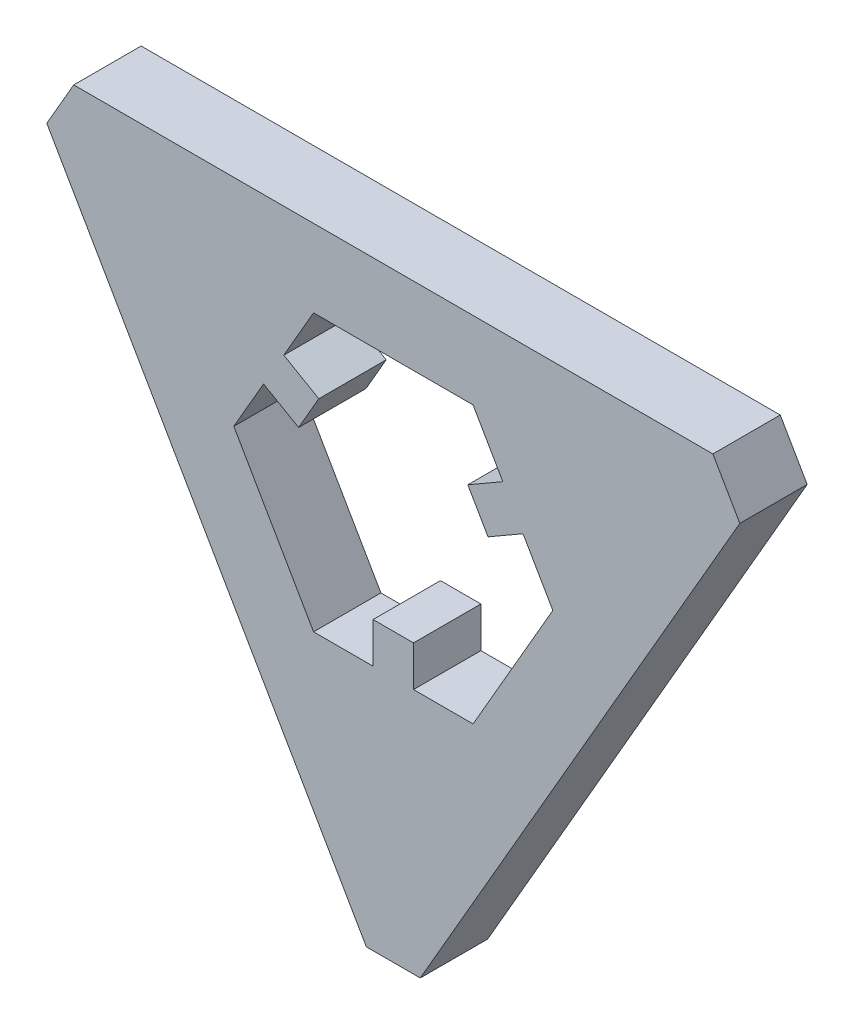
ISO-10303-21;
HEADER;
FILE_DESCRIPTION(('STEP AP214'),'2;1');
FILE_NAME('part.step','',(''),(''),'','','');
FILE_SCHEMA(('AUTOMOTIVE_DESIGN { 1 0 10303 214 1 1 1 1 }'));
ENDSEC;
DATA;
#1=APPLICATION_CONTEXT('core data for automotive mechanical design processes');
#2=APPLICATION_PROTOCOL_DEFINITION('international standard','automotive_design',2000,#1);
#3=PRODUCT_CONTEXT('',#1,'mechanical');
#4=PRODUCT('Part','Part','',(#3));
#5=PRODUCT_RELATED_PRODUCT_CATEGORY('part','',(#4));
#6=PRODUCT_DEFINITION_FORMATION('','',#4);
#7=PRODUCT_DEFINITION_CONTEXT('part definition',#1,'design');
#8=PRODUCT_DEFINITION('design','',#6,#7);
#9=PRODUCT_DEFINITION_SHAPE('','',#8);
#10=(LENGTH_UNIT() NAMED_UNIT(*) SI_UNIT(.MILLI.,.METRE.));
#11=(NAMED_UNIT(*) PLANE_ANGLE_UNIT() SI_UNIT($,.RADIAN.));
#12=(NAMED_UNIT(*) SI_UNIT($,.STERADIAN.) SOLID_ANGLE_UNIT());
#13=UNCERTAINTY_MEASURE_WITH_UNIT(LENGTH_MEASURE(1.E-05),#10,'distance_accuracy_value','');
#14=(GEOMETRIC_REPRESENTATION_CONTEXT(3) GLOBAL_UNCERTAINTY_ASSIGNED_CONTEXT((#13)) GLOBAL_UNIT_ASSIGNED_CONTEXT((#10,
#11,#12)) REPRESENTATION_CONTEXT('',''));
#15=CARTESIAN_POINT('',(0.,0.,0.));
#16=DIRECTION('',(0.,0.,1.));
#17=DIRECTION('',(1.,0.,0.));
#18=AXIS2_PLACEMENT_3D('',#15,#16,#17);
#19=CARTESIAN_POINT('',(0.,0.,-250.));
#20=DIRECTION('',(0.,0.,1.));
#21=DIRECTION('',(1.,0.,0.));
#22=AXIS2_PLACEMENT_3D('',#19,#20,#21);
#23=PLANE('',#22);
#24=DIRECTION('',(-0.5,-0.866025403784439,0.));
#25=VECTOR('',#24,1.);
#26=CARTESIAN_POINT('',(-23.6713610367747,0.,-250.));
#27=LINE('',#26,#25);
#28=CARTESIAN_POINT('',(-11.8356805183874,20.5,-250.));
#29=VERTEX_POINT('',#28);
#30=CARTESIAN_POINT('',(-16.2535207775811,12.8480762113533,-250.));
#31=VERTEX_POINT('',#30);
#32=EDGE_CURVE('E127',#29,#31,#27,.T.);
#33=ORIENTED_EDGE('',*,*,#32,.F.);
#34=DIRECTION('',(-1.,0.,0.));
#35=VECTOR('',#34,1.);
#36=CARTESIAN_POINT('',(-11.8356805183874,20.5,-250.));
#37=LINE('',#36,#35);
#38=CARTESIAN_POINT('',(11.8356805183873,20.5,-250.));
#39=VERTEX_POINT('',#38);
#40=EDGE_CURVE('E153',#39,#29,#37,.T.);
#41=ORIENTED_EDGE('',*,*,#40,.F.);
#42=DIRECTION('',(-0.5,0.866025403784439,0.));
#43=VECTOR('',#42,1.);
#44=CARTESIAN_POINT('',(11.8356805183873,20.5,-250.));
#45=LINE('',#44,#43);
#46=CARTESIAN_POINT('',(16.2535207775809,12.8480762113534,-250.));
#47=VERTEX_POINT('',#46);
#48=EDGE_CURVE('E156',#47,#39,#45,.T.);
#49=ORIENTED_EDGE('',*,*,#48,.F.);
#50=DIRECTION('',(0.86602540378443,0.500000000000016,0.));
#51=VECTOR('',#50,1.);
#52=CARTESIAN_POINT('',(16.2535207775809,12.8480762113534,-250.));
#53=LINE('',#52,#51);
#54=CARTESIAN_POINT('',(11.0573683548744,9.84807621135332,-250.));
#55=VERTEX_POINT('',#54);
#56=EDGE_CURVE('E174',#55,#47,#53,.T.);
#57=ORIENTED_EDGE('',*,*,#56,.F.);
#58=DIRECTION('',(-0.500000000000003,0.866025403784437,0.));
#59=VECTOR('',#58,1.);
#60=CARTESIAN_POINT('',(11.0573683548744,9.84807621135332,-250.));
#61=LINE('',#60,#59);
#62=CARTESIAN_POINT('',(14.0573683548744,4.65192378864669,-250.));
#63=VERTEX_POINT('',#62);
#64=EDGE_CURVE('E171',#63,#55,#61,.T.);
#65=ORIENTED_EDGE('',*,*,#64,.F.);
#66=DIRECTION('',(-0.866025403784437,-0.500000000000003,0.));
#67=VECTOR('',#66,1.);
#68=CARTESIAN_POINT('',(14.0573683548744,4.65192378864669,-250.));
#69=LINE('',#68,#67);
#70=CARTESIAN_POINT('',(19.253520777581,7.65192378864671,-250.));
#71=VERTEX_POINT('',#70);
#72=EDGE_CURVE('E168',#71,#63,#69,.T.);
#73=ORIENTED_EDGE('',*,*,#72,.F.);
#74=DIRECTION('',(-0.5,0.866025403784439,0.));
#75=VECTOR('',#74,1.);
#76=CARTESIAN_POINT('',(11.8356805183873,20.5,-250.));
#77=LINE('',#76,#75);
#78=CARTESIAN_POINT('',(23.6713610367747,0.,-250.));
#79=VERTEX_POINT('',#78);
#80=EDGE_CURVE('E130',#79,#71,#77,.T.);
#81=ORIENTED_EDGE('',*,*,#80,.F.);
#82=DIRECTION('',(0.5,0.866025403784439,0.));
#83=VECTOR('',#82,1.);
#84=CARTESIAN_POINT('',(23.6713610367747,0.,-250.));
#85=LINE('',#84,#83);
#86=CARTESIAN_POINT('',(11.8356805183873,-20.5,-250.));
#87=VERTEX_POINT('',#86);
#88=EDGE_CURVE('E141',#87,#79,#85,.T.);
#89=ORIENTED_EDGE('',*,*,#88,.F.);
#90=DIRECTION('',(1.,0.,0.));
#91=VECTOR('',#90,1.);
#92=CARTESIAN_POINT('',(11.8356805183873,-20.5,-250.));
#93=LINE('',#92,#91);
#94=CARTESIAN_POINT('',(3.,-20.5,-250.));
#95=VERTEX_POINT('',#94);
#96=EDGE_CURVE('E144',#95,#87,#93,.T.);
#97=ORIENTED_EDGE('',*,*,#96,.F.);
#98=DIRECTION('',(0.,-1.,0.));
#99=VECTOR('',#98,1.);
#100=CARTESIAN_POINT('',(3.,-20.5,-250.));
#101=LINE('',#100,#99);
#102=CARTESIAN_POINT('',(3.,-14.5,-250.));
#103=VERTEX_POINT('',#102);
#104=EDGE_CURVE('E189',#103,#95,#101,.T.);
#105=ORIENTED_EDGE('',*,*,#104,.F.);
#106=DIRECTION('',(1.,0.,0.));
#107=VECTOR('',#106,1.);
#108=CARTESIAN_POINT('',(3.,-14.5,-250.));
#109=LINE('',#108,#107);
#110=CARTESIAN_POINT('',(-3.,-14.5,-250.));
#111=VERTEX_POINT('',#110);
#112=EDGE_CURVE('E99',#111,#103,#109,.T.);
#113=ORIENTED_EDGE('',*,*,#112,.F.);
#114=DIRECTION('',(0.,1.,0.));
#115=VECTOR('',#114,1.);
#116=CARTESIAN_POINT('',(-3.,-14.5,-250.));
#117=LINE('',#116,#115);
#118=CARTESIAN_POINT('',(-3.,-20.5,-250.));
#119=VERTEX_POINT('',#118);
#120=EDGE_CURVE('E186',#119,#111,#117,.T.);
#121=ORIENTED_EDGE('',*,*,#120,.F.);
#122=DIRECTION('',(1.,0.,0.));
#123=VECTOR('',#122,1.);
#124=CARTESIAN_POINT('',(11.8356805183873,-20.5,-250.));
#125=LINE('',#124,#123);
#126=CARTESIAN_POINT('',(-11.8356805183873,-20.5,-250.));
#127=VERTEX_POINT('',#126);
#128=EDGE_CURVE('E124',#127,#119,#125,.T.);
#129=ORIENTED_EDGE('',*,*,#128,.F.);
#130=DIRECTION('',(0.5,-0.866025403784438,0.));
#131=VECTOR('',#130,1.);
#132=CARTESIAN_POINT('',(-11.8356805183873,-20.5,-250.));
#133=LINE('',#132,#131);
#134=CARTESIAN_POINT('',(-23.6713610367747,0.,-250.));
#135=VERTEX_POINT('',#134);
#136=EDGE_CURVE('E147',#135,#127,#133,.T.);
#137=ORIENTED_EDGE('',*,*,#136,.F.);
#138=DIRECTION('',(-0.5,-0.866025403784439,0.));
#139=VECTOR('',#138,1.);
#140=CARTESIAN_POINT('',(-23.6713610367747,0.,-250.));
#141=LINE('',#140,#139);
#142=CARTESIAN_POINT('',(-19.2535207775811,7.65192378864667,-250.));
#143=VERTEX_POINT('',#142);
#144=EDGE_CURVE('E150',#143,#135,#141,.T.);
#145=ORIENTED_EDGE('',*,*,#144,.F.);
#146=DIRECTION('',(-0.866025403784439,0.499999999999999,0.));
#147=VECTOR('',#146,1.);
#148=CARTESIAN_POINT('',(-19.2535207775811,7.65192378864667,-250.));
#149=LINE('',#148,#147);
#150=CARTESIAN_POINT('',(-14.0573683548744,4.65192378864668,-250.));
#151=VERTEX_POINT('',#150);
#152=EDGE_CURVE('E183',#151,#143,#149,.T.);
#153=ORIENTED_EDGE('',*,*,#152,.F.);
#154=DIRECTION('',(-0.499999999999999,-0.866025403784439,0.));
#155=VECTOR('',#154,1.);
#156=CARTESIAN_POINT('',(-14.0573683548744,4.65192378864668,-250.));
#157=LINE('',#156,#155);
#158=CARTESIAN_POINT('',(-11.0573683548744,9.84807621135332,-250.));
#159=VERTEX_POINT('',#158);
#160=EDGE_CURVE('E180',#159,#151,#157,.T.);
#161=ORIENTED_EDGE('',*,*,#160,.F.);
#162=DIRECTION('',(0.866025403784442,-0.499999999999995,0.));
#163=VECTOR('',#162,1.);
#164=CARTESIAN_POINT('',(-11.0573683548744,9.84807621135332,-250.));
#165=LINE('',#164,#163);
#166=EDGE_CURVE('E177',#31,#159,#165,.T.);
#167=ORIENTED_EDGE('',*,*,#166,.F.);
#168=EDGE_LOOP('',(#33,#41,#49,#57,#65,#73,#81,#89,#97,#105,#113,#121,#129,#137,#145,#153,#161,#167));
#169=FACE_BOUND('',#168,.T.);
#170=DIRECTION('',(-0.500000000000001,-0.866025403784438,0.));
#171=VECTOR('',#170,1.);
#172=CARTESIAN_POINT('',(4.00002711889661,-57.0720970525392,-250.));
#173=LINE('',#172,#171);
#174=CARTESIAN_POINT('',(51.4258100782776,25.0717686218424,-250.));
#175=VERTEX_POINT('',#174);
#176=CARTESIAN_POINT('',(4.00002711889663,-57.0720970525392,-250.));
#177=VERTEX_POINT('',#176);
#178=EDGE_CURVE('E135',#175,#177,#173,.T.);
#179=ORIENTED_EDGE('',*,*,#178,.F.);
#180=DIRECTION('',(0.499999910244853,-0.866025455604591,0.));
#181=VECTOR('',#180,1.);
#182=CARTESIAN_POINT('',(47.4258047104851,31.9999828076548,-250.));
#183=LINE('',#182,#181);
#184=CARTESIAN_POINT('',(47.4258047104851,31.9999828076548,-250.));
#185=VERTEX_POINT('',#184);
#186=EDGE_CURVE('E159',#185,#175,#183,.T.);
#187=ORIENTED_EDGE('',*,*,#186,.F.);
#188=DIRECTION('',(1.,0.,0.));
#189=VECTOR('',#188,1.);
#190=CARTESIAN_POINT('',(47.4258047104851,31.9999828076548,-250.));
#191=LINE('',#190,#189);
#192=CARTESIAN_POINT('',(-47.4255638428803,31.9999828076547,-250.));
#193=VERTEX_POINT('',#192);
#194=EDGE_CURVE('E132',#193,#185,#191,.T.);
#195=ORIENTED_EDGE('',*,*,#194,.F.);
#196=DIRECTION('',(0.500034807579477,0.866005306686371,0.));
#197=VECTOR('',#196,1.);
#198=CARTESIAN_POINT('',(-51.4258483825629,25.0719298259231,-250.));
#199=LINE('',#198,#197);
#200=CARTESIAN_POINT('',(-51.4258483825629,25.0719298259231,-250.));
#201=VERTEX_POINT('',#200);
#202=EDGE_CURVE('E165',#201,#193,#199,.T.);
#203=ORIENTED_EDGE('',*,*,#202,.F.);
#204=DIRECTION('',(-0.5,0.866025403784438,0.));
#205=VECTOR('',#204,1.);
#206=CARTESIAN_POINT('',(-51.4258483825629,25.0719298259231,-250.));
#207=LINE('',#206,#205);
#208=CARTESIAN_POINT('',(-3.99997235196278,-57.0720970525392,-250.));
#209=VERTEX_POINT('',#208);
#210=EDGE_CURVE('E138',#209,#201,#207,.T.);
#211=ORIENTED_EDGE('',*,*,#210,.F.);
#212=DIRECTION('',(-1.,0.,0.));
#213=VECTOR('',#212,1.);
#214=CARTESIAN_POINT('',(4.00002711889663,-57.0720970525392,-250.));
#215=LINE('',#214,#213);
#216=EDGE_CURVE('E162',#177,#209,#215,.T.);
#217=ORIENTED_EDGE('',*,*,#216,.F.);
#218=EDGE_LOOP('',(#179,#187,#195,#203,#211,#217));
#219=FACE_BOUND('',#218,.T.);
#220=ADVANCED_FACE('F45',(#169,#219),#23,.T.);
#221=CARTESIAN_POINT('',(23.6713610367747,0.,-140.));
#222=DIRECTION('',(-0.866025403784439,0.5,0.));
#223=DIRECTION('',(0.,0.,1.));
#224=AXIS2_PLACEMENT_3D('',#221,#222,#223);
#225=PLANE('',#224);
#226=DIRECTION('',(0.,0.,1.));
#227=VECTOR('',#226,1.);
#228=CARTESIAN_POINT('',(11.8356805183873,-20.5,-140.));
#229=LINE('',#228,#227);
#230=CARTESIAN_POINT('',(11.8356805183873,-20.5,-260.));
#231=VERTEX_POINT('',#230);
#232=EDGE_CURVE('E48',#231,#87,#229,.T.);
#233=ORIENTED_EDGE('',*,*,#232,.T.);
#234=ORIENTED_EDGE('',*,*,#88,.T.);
#235=DIRECTION('',(0.,0.,-1.));
#236=VECTOR('',#235,1.);
#237=CARTESIAN_POINT('',(23.6713610367747,0.,-140.));
#238=LINE('',#237,#236);
#239=CARTESIAN_POINT('',(23.6713610367747,0.,-260.));
#240=VERTEX_POINT('',#239);
#241=EDGE_CURVE('E241',#79,#240,#238,.T.);
#242=ORIENTED_EDGE('',*,*,#241,.T.);
#243=DIRECTION('',(0.5,0.866025403784439,0.));
#244=VECTOR('',#243,1.);
#245=CARTESIAN_POINT('',(11.8356805183873,-20.5,-260.));
#246=LINE('',#245,#244);
#247=EDGE_CURVE('E280',#231,#240,#246,.T.);
#248=ORIENTED_EDGE('',*,*,#247,.F.);
#249=EDGE_LOOP('',(#233,#234,#242,#248));
#250=FACE_BOUND('',#249,.T.);
#251=ADVANCED_FACE('F274',(#250),#225,.T.);
#252=CARTESIAN_POINT('',(-11.8356805183873,-20.5,-140.));
#253=DIRECTION('',(0.866025403784438,0.5,0.));
#254=DIRECTION('',(0.,0.,-1.));
#255=AXIS2_PLACEMENT_3D('',#252,#253,#254);
#256=PLANE('',#255);
#257=DIRECTION('',(0.,0.,-1.));
#258=VECTOR('',#257,1.);
#259=CARTESIAN_POINT('',(-23.6713610367747,0.,-140.));
#260=LINE('',#259,#258);
#261=CARTESIAN_POINT('',(-23.6713610367747,0.,-260.));
#262=VERTEX_POINT('',#261);
#263=EDGE_CURVE('E254',#135,#262,#260,.T.);
#264=ORIENTED_EDGE('',*,*,#263,.F.);
#265=ORIENTED_EDGE('',*,*,#136,.T.);
#266=DIRECTION('',(0.,0.,-1.));
#267=VECTOR('',#266,1.);
#268=CARTESIAN_POINT('',(-11.8356805183873,-20.5,-140.));
#269=LINE('',#268,#267);
#270=CARTESIAN_POINT('',(-11.8356805183873,-20.5,-260.));
#271=VERTEX_POINT('',#270);
#272=EDGE_CURVE('E257',#127,#271,#269,.T.);
#273=ORIENTED_EDGE('',*,*,#272,.T.);
#274=DIRECTION('',(0.5,-0.866025403784438,0.));
#275=VECTOR('',#274,1.);
#276=CARTESIAN_POINT('',(-23.6713610367747,0.,-260.));
#277=LINE('',#276,#275);
#278=EDGE_CURVE('E439',#262,#271,#277,.T.);
#279=ORIENTED_EDGE('',*,*,#278,.F.);
#280=EDGE_LOOP('',(#264,#265,#273,#279));
#281=FACE_BOUND('',#280,.T.);
#282=ADVANCED_FACE('F606',(#281),#256,.T.);
#283=CARTESIAN_POINT('',(-11.8356805183874,20.5,-140.));
#284=DIRECTION('',(0.,-1.,0.));
#285=DIRECTION('',(0.,0.,-1.));
#286=AXIS2_PLACEMENT_3D('',#283,#284,#285);
#287=PLANE('',#286);
#288=DIRECTION('',(0.,0.,-1.));
#289=VECTOR('',#288,1.);
#290=CARTESIAN_POINT('',(11.8356805183873,20.5,-140.));
#291=LINE('',#290,#289);
#292=CARTESIAN_POINT('',(11.8356805183873,20.5,-260.));
#293=VERTEX_POINT('',#292);
#294=EDGE_CURVE('E246',#39,#293,#291,.T.);
#295=ORIENTED_EDGE('',*,*,#294,.F.);
#296=ORIENTED_EDGE('',*,*,#40,.T.);
#297=DIRECTION('',(0.,0.,-1.));
#298=VECTOR('',#297,1.);
#299=CARTESIAN_POINT('',(-11.8356805183874,20.5,-140.));
#300=LINE('',#299,#298);
#301=CARTESIAN_POINT('',(-11.8356805183874,20.5,-260.));
#302=VERTEX_POINT('',#301);
#303=EDGE_CURVE('E250',#29,#302,#300,.T.);
#304=ORIENTED_EDGE('',*,*,#303,.T.);
#305=DIRECTION('',(-1.,0.,0.));
#306=VECTOR('',#305,1.);
#307=CARTESIAN_POINT('',(11.8356805183873,20.5,-260.));
#308=LINE('',#307,#306);
#309=EDGE_CURVE('E418',#293,#302,#308,.T.);
#310=ORIENTED_EDGE('',*,*,#309,.F.);
#311=EDGE_LOOP('',(#295,#296,#304,#310));
#312=FACE_BOUND('',#311,.T.);
#313=ADVANCED_FACE('F422',(#312),#287,.T.);
#314=CARTESIAN_POINT('',(11.8356805183873,20.5,-140.));
#315=DIRECTION('',(-0.866025403784439,-0.5,0.));
#316=DIRECTION('',(-0.5,0.866025403784439,0.));
#317=AXIS2_PLACEMENT_3D('',#314,#315,#316);
#318=PLANE('',#317);
#319=ORIENTED_EDGE('',*,*,#241,.F.);
#320=ORIENTED_EDGE('',*,*,#80,.T.);
#321=DIRECTION('',(0.,0.,-1.));
#322=VECTOR('',#321,1.);
#323=CARTESIAN_POINT('',(19.253520777581,7.65192378864671,151.591109915469));
#324=LINE('',#323,#322);
#325=CARTESIAN_POINT('',(19.253520777581,7.65192378864671,-260.));
#326=VERTEX_POINT('',#325);
#327=EDGE_CURVE('E11',#71,#326,#324,.T.);
#328=ORIENTED_EDGE('',*,*,#327,.T.);
#329=DIRECTION('',(-0.5,0.866025403784439,0.));
#330=VECTOR('',#329,1.);
#331=CARTESIAN_POINT('',(23.6713610367747,0.,-260.));
#332=LINE('',#331,#330);
#333=EDGE_CURVE('E421',#240,#326,#332,.T.);
#334=ORIENTED_EDGE('',*,*,#333,.F.);
#335=EDGE_LOOP('',(#319,#320,#328,#334));
#336=FACE_BOUND('',#335,.T.);
#337=ADVANCED_FACE('F554',(#336),#318,.T.);
#338=CARTESIAN_POINT('',(14.0573683548744,4.65192378864669,151.591109915469));
#339=DIRECTION('',(0.500000000000003,-0.866025403784437,0.));
#340=DIRECTION('',(0.866025403784437,0.500000000000003,0.));
#341=AXIS2_PLACEMENT_3D('',#338,#339,#340);
#342=PLANE('',#341);
#343=ORIENTED_EDGE('',*,*,#327,.F.);
#344=ORIENTED_EDGE('',*,*,#72,.T.);
#345=DIRECTION('',(0.,0.,-1.));
#346=VECTOR('',#345,1.);
#347=CARTESIAN_POINT('',(14.0573683548744,4.65192378864669,151.591109915469));
#348=LINE('',#347,#346);
#349=CARTESIAN_POINT('',(14.0573683548744,4.65192378864669,-260.));
#350=VERTEX_POINT('',#349);
#351=EDGE_CURVE('E195',#63,#350,#348,.T.);
#352=ORIENTED_EDGE('',*,*,#351,.T.);
#353=DIRECTION('',(-0.866025403784437,-0.500000000000003,0.));
#354=VECTOR('',#353,1.);
#355=CARTESIAN_POINT('',(14.0573683548744,4.65192378864669,-260.));
#356=LINE('',#355,#354);
#357=EDGE_CURVE('E201',#326,#350,#356,.T.);
#358=ORIENTED_EDGE('',*,*,#357,.F.);
#359=EDGE_LOOP('',(#343,#344,#352,#358));
#360=FACE_BOUND('',#359,.T.);
#361=ADVANCED_FACE('F591',(#360),#342,.T.);
#362=CARTESIAN_POINT('',(-23.6713610367747,0.,-140.));
#363=DIRECTION('',(0.866025403784439,-0.5,0.));
#364=DIRECTION('',(0.,0.,-1.));
#365=AXIS2_PLACEMENT_3D('',#362,#363,#364);
#366=PLANE('',#365);
#367=ORIENTED_EDGE('',*,*,#303,.F.);
#368=ORIENTED_EDGE('',*,*,#32,.T.);
#369=DIRECTION('',(0.,0.,-1.));
#370=VECTOR('',#369,1.);
#371=CARTESIAN_POINT('',(-16.2535207775811,12.8480762113533,151.591109915469));
#372=LINE('',#371,#370);
#373=CARTESIAN_POINT('',(-16.2535207775811,12.8480762113533,-260.));
#374=VERTEX_POINT('',#373);
#375=EDGE_CURVE('E199',#31,#374,#372,.T.);
#376=ORIENTED_EDGE('',*,*,#375,.T.);
#377=DIRECTION('',(-0.5,-0.866025403784439,0.));
#378=VECTOR('',#377,1.);
#379=CARTESIAN_POINT('',(-11.8356805183874,20.5,-260.));
#380=LINE('',#379,#378);
#381=EDGE_CURVE('E245',#302,#374,#380,.T.);
#382=ORIENTED_EDGE('',*,*,#381,.F.);
#383=EDGE_LOOP('',(#367,#368,#376,#382));
#384=FACE_BOUND('',#383,.T.);
#385=ADVANCED_FACE('F487',(#384),#366,.T.);
#386=CARTESIAN_POINT('',(-11.0573683548744,9.84807621135332,151.591109915469));
#387=DIRECTION('',(0.499999999999995,0.866025403784442,0.));
#388=DIRECTION('',(-0.866025403784442,0.499999999999995,0.));
#389=AXIS2_PLACEMENT_3D('',#386,#387,#388);
#390=PLANE('',#389);
#391=ORIENTED_EDGE('',*,*,#375,.F.);
#392=ORIENTED_EDGE('',*,*,#166,.T.);
#393=DIRECTION('',(0.,0.,-1.));
#394=VECTOR('',#393,1.);
#395=CARTESIAN_POINT('',(-11.0573683548744,9.84807621135332,151.591109915469));
#396=LINE('',#395,#394);
#397=CARTESIAN_POINT('',(-11.0573683548744,9.84807621135332,-260.));
#398=VERTEX_POINT('',#397);
#399=EDGE_CURVE('E207',#159,#398,#396,.T.);
#400=ORIENTED_EDGE('',*,*,#399,.T.);
#401=DIRECTION('',(0.866025403784442,-0.499999999999995,0.));
#402=VECTOR('',#401,1.);
#403=CARTESIAN_POINT('',(-11.0573683548744,9.84807621135332,-260.));
#404=LINE('',#403,#402);
#405=EDGE_CURVE('E358',#374,#398,#404,.T.);
#406=ORIENTED_EDGE('',*,*,#405,.F.);
#407=EDGE_LOOP('',(#391,#392,#400,#406));
#408=FACE_BOUND('',#407,.T.);
#409=ADVANCED_FACE('F368',(#408),#390,.T.);
#410=CARTESIAN_POINT('',(11.8356805183873,-20.5,-140.));
#411=DIRECTION('',(0.,1.,0.));
#412=DIRECTION('',(1.,0.,0.));
#413=AXIS2_PLACEMENT_3D('',#410,#411,#412);
#414=PLANE('',#413);
#415=ORIENTED_EDGE('',*,*,#272,.F.);
#416=ORIENTED_EDGE('',*,*,#128,.T.);
#417=DIRECTION('',(0.,0.,-1.));
#418=VECTOR('',#417,1.);
#419=CARTESIAN_POINT('',(-3.,-20.5,151.591109915469));
#420=LINE('',#419,#418);
#421=CARTESIAN_POINT('',(-3.,-20.5,-260.));
#422=VERTEX_POINT('',#421);
#423=EDGE_CURVE('E211',#119,#422,#420,.T.);
#424=ORIENTED_EDGE('',*,*,#423,.T.);
#425=DIRECTION('',(1.,0.,0.));
#426=VECTOR('',#425,1.);
#427=CARTESIAN_POINT('',(-11.8356805183873,-20.5,-260.));
#428=LINE('',#427,#426);
#429=EDGE_CURVE('E436',#271,#422,#428,.T.);
#430=ORIENTED_EDGE('',*,*,#429,.F.);
#431=EDGE_LOOP('',(#415,#416,#424,#430));
#432=FACE_BOUND('',#431,.T.);
#433=ADVANCED_FACE('F569',(#432),#414,.T.);
#434=CARTESIAN_POINT('',(-3.,-14.5,151.591109915469));
#435=DIRECTION('',(-1.,0.,0.));
#436=DIRECTION('',(0.,-1.,0.));
#437=AXIS2_PLACEMENT_3D('',#434,#435,#436);
#438=PLANE('',#437);
#439=ORIENTED_EDGE('',*,*,#423,.F.);
#440=ORIENTED_EDGE('',*,*,#120,.T.);
#441=DIRECTION('',(0.,0.,-1.));
#442=VECTOR('',#441,1.);
#443=CARTESIAN_POINT('',(-3.,-14.5,151.591109915469));
#444=LINE('',#443,#442);
#445=CARTESIAN_POINT('',(-3.,-14.5,-260.));
#446=VERTEX_POINT('',#445);
#447=EDGE_CURVE('E86',#111,#446,#444,.T.);
#448=ORIENTED_EDGE('',*,*,#447,.T.);
#449=DIRECTION('',(0.,1.,0.));
#450=VECTOR('',#449,1.);
#451=CARTESIAN_POINT('',(-3.,-14.5,-260.));
#452=LINE('',#451,#450);
#453=EDGE_CURVE('E115',#422,#446,#452,.T.);
#454=ORIENTED_EDGE('',*,*,#453,.F.);
#455=EDGE_LOOP('',(#439,#440,#448,#454));
#456=FACE_BOUND('',#455,.T.);
#457=ADVANCED_FACE('F575',(#456),#438,.T.);
#458=CARTESIAN_POINT('',(-1.91521426717856E-05,-12.5360571224422,-260.));
#459=DIRECTION('',(0.,0.,-1.));
#460=DIRECTION('',(0.,-1.,0.));
#461=AXIS2_PLACEMENT_3D('',#458,#459,#460);
#462=PLANE('',#461);
#463=ORIENTED_EDGE('',*,*,#278,.T.);
#464=ORIENTED_EDGE('',*,*,#429,.T.);
#465=ORIENTED_EDGE('',*,*,#453,.T.);
#466=DIRECTION('',(1.,0.,0.));
#467=VECTOR('',#466,1.);
#468=CARTESIAN_POINT('',(3.,-14.5,-260.));
#469=LINE('',#468,#467);
#470=CARTESIAN_POINT('',(3.,-14.5,-260.));
#471=VERTEX_POINT('',#470);
#472=EDGE_CURVE('E95',#446,#471,#469,.T.);
#473=ORIENTED_EDGE('',*,*,#472,.T.);
#474=DIRECTION('',(0.,-1.,0.));
#475=VECTOR('',#474,1.);
#476=CARTESIAN_POINT('',(3.,-20.5,-260.));
#477=LINE('',#476,#475);
#478=CARTESIAN_POINT('',(3.,-20.5,-260.));
#479=VERTEX_POINT('',#478);
#480=EDGE_CURVE('E112',#471,#479,#477,.T.);
#481=ORIENTED_EDGE('',*,*,#480,.T.);
#482=EDGE_CURVE('E285',#479,#231,#428,.T.);
#483=ORIENTED_EDGE('',*,*,#482,.T.);
#484=ORIENTED_EDGE('',*,*,#247,.T.);
#485=ORIENTED_EDGE('',*,*,#333,.T.);
#486=ORIENTED_EDGE('',*,*,#357,.T.);
#487=DIRECTION('',(-0.500000000000003,0.866025403784437,0.));
#488=VECTOR('',#487,1.);
#489=CARTESIAN_POINT('',(11.0573683548744,9.84807621135332,-260.));
#490=LINE('',#489,#488);
#491=CARTESIAN_POINT('',(11.0573683548744,9.84807621135332,-260.));
#492=VERTEX_POINT('',#491);
#493=EDGE_CURVE('E348',#350,#492,#490,.T.);
#494=ORIENTED_EDGE('',*,*,#493,.T.);
#495=DIRECTION('',(0.86602540378443,0.500000000000016,0.));
#496=VECTOR('',#495,1.);
#497=CARTESIAN_POINT('',(16.2535207775809,12.8480762113534,-260.));
#498=LINE('',#497,#496);
#499=CARTESIAN_POINT('',(16.253520777581,12.8480762113534,-260.));
#500=VERTEX_POINT('',#499);
#501=EDGE_CURVE('E198',#492,#500,#498,.T.);
#502=ORIENTED_EDGE('',*,*,#501,.T.);
#503=EDGE_CURVE('E412',#500,#293,#332,.T.);
#504=ORIENTED_EDGE('',*,*,#503,.T.);
#505=ORIENTED_EDGE('',*,*,#309,.T.);
#506=ORIENTED_EDGE('',*,*,#381,.T.);
#507=ORIENTED_EDGE('',*,*,#405,.T.);
#508=DIRECTION('',(-0.499999999999999,-0.866025403784439,0.));
#509=VECTOR('',#508,1.);
#510=CARTESIAN_POINT('',(-14.0573683548744,4.65192378864668,-260.));
#511=LINE('',#510,#509);
#512=CARTESIAN_POINT('',(-14.0573683548744,4.65192378864668,-260.));
#513=VERTEX_POINT('',#512);
#514=EDGE_CURVE('E355',#398,#513,#511,.T.);
#515=ORIENTED_EDGE('',*,*,#514,.T.);
#516=DIRECTION('',(-0.866025403784439,0.499999999999999,0.));
#517=VECTOR('',#516,1.);
#518=CARTESIAN_POINT('',(-19.2535207775811,7.65192378864667,-260.));
#519=LINE('',#518,#517);
#520=CARTESIAN_POINT('',(-19.2535207775811,7.65192378864667,-260.));
#521=VERTEX_POINT('',#520);
#522=EDGE_CURVE('E208',#513,#521,#519,.T.);
#523=ORIENTED_EDGE('',*,*,#522,.T.);
#524=EDGE_CURVE('E425',#521,#262,#380,.T.);
#525=ORIENTED_EDGE('',*,*,#524,.T.);
#526=EDGE_LOOP('',(#463,#464,#465,#473,#481,#483,#484,#485,#486,#494,#502,#504,#505,#506,#507,
#515,#523,#525));
#527=FACE_BOUND('',#526,.T.);
#528=DIRECTION('',(0.499999910244853,-0.866025455604591,0.));
#529=VECTOR('',#528,1.);
#530=CARTESIAN_POINT('',(47.4258047104851,31.9999828076548,-260.));
#531=LINE('',#530,#529);
#532=CARTESIAN_POINT('',(47.4258047104851,31.9999828076548,-260.));
#533=VERTEX_POINT('',#532);
#534=CARTESIAN_POINT('',(51.4258100782776,25.0717686218424,-260.));
#535=VERTEX_POINT('',#534);
#536=EDGE_CURVE('E235',#533,#535,#531,.T.);
#537=ORIENTED_EDGE('',*,*,#536,.T.);
#538=DIRECTION('',(-0.5,-0.866025403784437,0.));
#539=VECTOR('',#538,1.);
#540=CARTESIAN_POINT('',(51.4258100782776,25.0717686218424,-260.));
#541=LINE('',#540,#539);
#542=CARTESIAN_POINT('',(4.00002711889663,-57.0720970525392,-260.));
#543=VERTEX_POINT('',#542);
#544=EDGE_CURVE('E240',#535,#543,#541,.T.);
#545=ORIENTED_EDGE('',*,*,#544,.T.);
#546=DIRECTION('',(-1.,0.,0.));
#547=VECTOR('',#546,1.);
#548=CARTESIAN_POINT('',(-3.99997235196278,-57.0720970525392,-260.));
#549=LINE('',#548,#547);
#550=CARTESIAN_POINT('',(-3.99997235196278,-57.0720970525392,-260.));
#551=VERTEX_POINT('',#550);
#552=EDGE_CURVE('E226',#543,#551,#549,.T.);
#553=ORIENTED_EDGE('',*,*,#552,.T.);
#554=DIRECTION('',(-0.5,0.866025403784439,0.));
#555=VECTOR('',#554,1.);
#556=CARTESIAN_POINT('',(-3.99997235196278,-57.0720970525392,-260.));
#557=LINE('',#556,#555);
#558=CARTESIAN_POINT('',(-51.4258483825629,25.0719298259231,-260.));
#559=VERTEX_POINT('',#558);
#560=EDGE_CURVE('E329',#551,#559,#557,.T.);
#561=ORIENTED_EDGE('',*,*,#560,.T.);
#562=DIRECTION('',(0.500034807579477,0.866005306686371,0.));
#563=VECTOR('',#562,1.);
#564=CARTESIAN_POINT('',(-47.4255638428803,31.9999828076547,-260.));
#565=LINE('',#564,#563);
#566=CARTESIAN_POINT('',(-47.4255638428803,31.9999828076547,-260.));
#567=VERTEX_POINT('',#566);
#568=EDGE_CURVE('E217',#559,#567,#565,.T.);
#569=ORIENTED_EDGE('',*,*,#568,.T.);
#570=DIRECTION('',(1.,0.,0.));
#571=VECTOR('',#570,1.);
#572=CARTESIAN_POINT('',(-47.4255638428803,31.9999828076547,-260.));
#573=LINE('',#572,#571);
#574=EDGE_CURVE('E335',#567,#533,#573,.T.);
#575=ORIENTED_EDGE('',*,*,#574,.T.);
#576=EDGE_LOOP('',(#537,#545,#553,#561,#569,#575));
#577=FACE_BOUND('',#576,.T.);
#578=ADVANCED_FACE('F108',(#527,#577),#462,.T.);
#579=DIRECTION('',(0.,0.,-1.));
#580=VECTOR('',#579,1.);
#581=CARTESIAN_POINT('',(3.,-20.5,151.591109915469));
#582=LINE('',#581,#580);
#583=EDGE_CURVE('E103',#95,#479,#582,.T.);
#584=ORIENTED_EDGE('',*,*,#583,.F.);
#585=ORIENTED_EDGE('',*,*,#96,.T.);
#586=ORIENTED_EDGE('',*,*,#232,.F.);
#587=ORIENTED_EDGE('',*,*,#482,.F.);
#588=EDGE_LOOP('',(#584,#585,#586,#587));
#589=FACE_BOUND('',#588,.T.);
#590=ADVANCED_FACE('F284',(#589),#414,.T.);
#591=CARTESIAN_POINT('',(3.,-14.5,151.591109915469));
#592=DIRECTION('',(0.,1.,0.));
#593=DIRECTION('',(0.,0.,1.));
#594=AXIS2_PLACEMENT_3D('',#591,#592,#593);
#595=PLANE('',#594);
#596=ORIENTED_EDGE('',*,*,#447,.F.);
#597=ORIENTED_EDGE('',*,*,#112,.T.);
#598=DIRECTION('',(0.,0.,-1.));
#599=VECTOR('',#598,1.);
#600=CARTESIAN_POINT('',(3.,-14.5,151.591109915469));
#601=LINE('',#600,#599);
#602=EDGE_CURVE('E92',#103,#471,#601,.T.);
#603=ORIENTED_EDGE('',*,*,#602,.T.);
#604=ORIENTED_EDGE('',*,*,#472,.F.);
#605=EDGE_LOOP('',(#596,#597,#603,#604));
#606=FACE_BOUND('',#605,.T.);
#607=ADVANCED_FACE('F94',(#606),#595,.T.);
#608=CARTESIAN_POINT('',(3.,-20.5,151.591109915469));
#609=DIRECTION('',(1.,0.,0.));
#610=DIRECTION('',(0.,1.,0.));
#611=AXIS2_PLACEMENT_3D('',#608,#609,#610);
#612=PLANE('',#611);
#613=ORIENTED_EDGE('',*,*,#602,.F.);
#614=ORIENTED_EDGE('',*,*,#104,.T.);
#615=ORIENTED_EDGE('',*,*,#583,.T.);
#616=ORIENTED_EDGE('',*,*,#480,.F.);
#617=EDGE_LOOP('',(#613,#614,#615,#616));
#618=FACE_BOUND('',#617,.T.);
#619=ADVANCED_FACE('F118',(#618),#612,.T.);
#620=DIRECTION('',(0.,0.,-1.));
#621=VECTOR('',#620,1.);
#622=CARTESIAN_POINT('',(-19.2535207775811,7.65192378864667,151.591109915469));
#623=LINE('',#622,#621);
#624=EDGE_CURVE('E202',#143,#521,#623,.T.);
#625=ORIENTED_EDGE('',*,*,#624,.F.);
#626=ORIENTED_EDGE('',*,*,#144,.T.);
#627=ORIENTED_EDGE('',*,*,#263,.T.);
#628=ORIENTED_EDGE('',*,*,#524,.F.);
#629=EDGE_LOOP('',(#625,#626,#627,#628));
#630=FACE_BOUND('',#629,.T.);
#631=ADVANCED_FACE('F557',(#630),#366,.T.);
#632=CARTESIAN_POINT('',(-14.0573683548744,4.65192378864668,151.591109915469));
#633=DIRECTION('',(0.866025403784439,-0.499999999999999,0.));
#634=DIRECTION('',(0.499999999999999,0.866025403784439,0.));
#635=AXIS2_PLACEMENT_3D('',#632,#633,#634);
#636=PLANE('',#635);
#637=ORIENTED_EDGE('',*,*,#399,.F.);
#638=ORIENTED_EDGE('',*,*,#160,.T.);
#639=DIRECTION('',(0.,0.,-1.));
#640=VECTOR('',#639,1.);
#641=CARTESIAN_POINT('',(-14.0573683548744,4.65192378864668,151.591109915469));
#642=LINE('',#641,#640);
#643=EDGE_CURVE('E205',#151,#513,#642,.T.);
#644=ORIENTED_EDGE('',*,*,#643,.T.);
#645=ORIENTED_EDGE('',*,*,#514,.F.);
#646=EDGE_LOOP('',(#637,#638,#644,#645));
#647=FACE_BOUND('',#646,.T.);
#648=ADVANCED_FACE('F374',(#647),#636,.T.);
#649=CARTESIAN_POINT('',(-19.2535207775811,7.65192378864667,151.591109915469));
#650=DIRECTION('',(-0.499999999999999,-0.866025403784439,0.));
#651=DIRECTION('',(0.866025403784439,-0.499999999999999,0.));
#652=AXIS2_PLACEMENT_3D('',#649,#650,#651);
#653=PLANE('',#652);
#654=ORIENTED_EDGE('',*,*,#643,.F.);
#655=ORIENTED_EDGE('',*,*,#152,.T.);
#656=ORIENTED_EDGE('',*,*,#624,.T.);
#657=ORIENTED_EDGE('',*,*,#522,.F.);
#658=EDGE_LOOP('',(#654,#655,#656,#657));
#659=FACE_BOUND('',#658,.T.);
#660=ADVANCED_FACE('F379',(#659),#653,.T.);
#661=DIRECTION('',(0.,0.,-1.));
#662=VECTOR('',#661,1.);
#663=CARTESIAN_POINT('',(16.2535207775809,12.8480762113534,151.591109915469));
#664=LINE('',#663,#662);
#665=EDGE_CURVE('E54',#47,#500,#664,.T.);
#666=ORIENTED_EDGE('',*,*,#665,.F.);
#667=ORIENTED_EDGE('',*,*,#48,.T.);
#668=ORIENTED_EDGE('',*,*,#294,.T.);
#669=ORIENTED_EDGE('',*,*,#503,.F.);
#670=EDGE_LOOP('',(#666,#667,#668,#669));
#671=FACE_BOUND('',#670,.T.);
#672=ADVANCED_FACE('F411',(#671),#318,.T.);
#673=CARTESIAN_POINT('',(11.0573683548744,9.84807621135332,151.591109915469));
#674=DIRECTION('',(-0.866025403784437,-0.500000000000003,0.));
#675=DIRECTION('',(0.500000000000003,-0.866025403784437,0.));
#676=AXIS2_PLACEMENT_3D('',#673,#674,#675);
#677=PLANE('',#676);
#678=ORIENTED_EDGE('',*,*,#351,.F.);
#679=ORIENTED_EDGE('',*,*,#64,.T.);
#680=DIRECTION('',(0.,0.,-1.));
#681=VECTOR('',#680,1.);
#682=CARTESIAN_POINT('',(11.0573683548744,9.84807621135332,151.591109915469));
#683=LINE('',#682,#681);
#684=EDGE_CURVE('E193',#55,#492,#683,.T.);
#685=ORIENTED_EDGE('',*,*,#684,.T.);
#686=ORIENTED_EDGE('',*,*,#493,.F.);
#687=EDGE_LOOP('',(#678,#679,#685,#686));
#688=FACE_BOUND('',#687,.T.);
#689=ADVANCED_FACE('F552',(#688),#677,.T.);
#690=CARTESIAN_POINT('',(16.2535207775809,12.8480762113534,151.591109915469));
#691=DIRECTION('',(-0.500000000000015,0.86602540378443,0.));
#692=DIRECTION('',(-0.86602540378443,-0.500000000000016,0.));
#693=AXIS2_PLACEMENT_3D('',#690,#691,#692);
#694=PLANE('',#693);
#695=ORIENTED_EDGE('',*,*,#684,.F.);
#696=ORIENTED_EDGE('',*,*,#56,.T.);
#697=ORIENTED_EDGE('',*,*,#665,.T.);
#698=ORIENTED_EDGE('',*,*,#501,.F.);
#699=EDGE_LOOP('',(#695,#696,#697,#698));
#700=FACE_BOUND('',#699,.T.);
#701=ADVANCED_FACE('F545',(#700),#694,.T.);
#702=CARTESIAN_POINT('',(47.4258047104851,31.9999828076548,0.));
#703=DIRECTION('',(0.,1.,0.));
#704=DIRECTION('',(1.,0.,0.));
#705=AXIS2_PLACEMENT_3D('',#702,#703,#704);
#706=PLANE('',#705);
#707=DIRECTION('',(0.,0.,-1.));
#708=VECTOR('',#707,1.);
#709=CARTESIAN_POINT('',(-47.4255638428803,31.9999828076547,-140.));
#710=LINE('',#709,#708);
#711=EDGE_CURVE('E213',#193,#567,#710,.T.);
#712=ORIENTED_EDGE('',*,*,#711,.F.);
#713=ORIENTED_EDGE('',*,*,#194,.T.);
#714=DIRECTION('',(0.,0.,-1.));
#715=VECTOR('',#714,1.);
#716=CARTESIAN_POINT('',(47.4258047104851,31.9999828076548,-140.));
#717=LINE('',#716,#715);
#718=EDGE_CURVE('E236',#185,#533,#717,.T.);
#719=ORIENTED_EDGE('',*,*,#718,.T.);
#720=ORIENTED_EDGE('',*,*,#574,.F.);
#721=EDGE_LOOP('',(#712,#713,#719,#720));
#722=FACE_BOUND('',#721,.T.);
#723=ADVANCED_FACE('F496',(#722),#706,.T.);
#724=CARTESIAN_POINT('',(-51.4258483825629,25.0719298259231,0.));
#725=DIRECTION('',(-0.866025403784438,-0.5,0.));
#726=DIRECTION('',(-0.5,0.866025403784438,0.));
#727=AXIS2_PLACEMENT_3D('',#724,#725,#726);
#728=PLANE('',#727);
#729=DIRECTION('',(0.,0.,-1.));
#730=VECTOR('',#729,1.);
#731=CARTESIAN_POINT('',(-3.99997235196278,-57.0720970525392,-140.));
#732=LINE('',#731,#730);
#733=EDGE_CURVE('E222',#209,#551,#732,.T.);
#734=ORIENTED_EDGE('',*,*,#733,.F.);
#735=ORIENTED_EDGE('',*,*,#210,.T.);
#736=DIRECTION('',(0.,0.,-1.));
#737=VECTOR('',#736,1.);
#738=CARTESIAN_POINT('',(-51.4258483825629,25.0719298259231,-140.));
#739=LINE('',#738,#737);
#740=EDGE_CURVE('E218',#201,#559,#739,.T.);
#741=ORIENTED_EDGE('',*,*,#740,.T.);
#742=ORIENTED_EDGE('',*,*,#560,.F.);
#743=EDGE_LOOP('',(#734,#735,#741,#742));
#744=FACE_BOUND('',#743,.T.);
#745=ADVANCED_FACE('F330',(#744),#728,.T.);
#746=CARTESIAN_POINT('',(-51.4258483825629,25.0719298259231,-140.));
#747=DIRECTION('',(-0.866005306686371,0.500034807579477,0.));
#748=DIRECTION('',(0.,0.,1.));
#749=AXIS2_PLACEMENT_3D('',#746,#747,#748);
#750=PLANE('',#749);
#751=ORIENTED_EDGE('',*,*,#740,.F.);
#752=ORIENTED_EDGE('',*,*,#202,.T.);
#753=ORIENTED_EDGE('',*,*,#711,.T.);
#754=ORIENTED_EDGE('',*,*,#568,.F.);
#755=EDGE_LOOP('',(#751,#752,#753,#754));
#756=FACE_BOUND('',#755,.T.);
#757=ADVANCED_FACE('F498',(#756),#750,.T.);
#758=CARTESIAN_POINT('',(4.00002711889661,-57.0720970525392,0.));
#759=DIRECTION('',(0.866025403784437,-0.5,0.));
#760=DIRECTION('',(0.,0.,-1.));
#761=AXIS2_PLACEMENT_3D('',#758,#759,#760);
#762=PLANE('',#761);
#763=DIRECTION('',(0.,0.,-1.));
#764=VECTOR('',#763,1.);
#765=CARTESIAN_POINT('',(51.4258100782776,25.0717686218424,-140.));
#766=LINE('',#765,#764);
#767=EDGE_CURVE('E231',#175,#535,#766,.T.);
#768=ORIENTED_EDGE('',*,*,#767,.F.);
#769=ORIENTED_EDGE('',*,*,#178,.T.);
#770=DIRECTION('',(0.,0.,-1.));
#771=VECTOR('',#770,1.);
#772=CARTESIAN_POINT('',(4.00002711889663,-57.0720970525392,-140.));
#773=LINE('',#772,#771);
#774=EDGE_CURVE('E227',#177,#543,#773,.T.);
#775=ORIENTED_EDGE('',*,*,#774,.T.);
#776=ORIENTED_EDGE('',*,*,#544,.F.);
#777=EDGE_LOOP('',(#768,#769,#775,#776));
#778=FACE_BOUND('',#777,.T.);
#779=ADVANCED_FACE('F460',(#778),#762,.T.);
#780=CARTESIAN_POINT('',(4.00002711889663,-57.0720970525392,-140.));
#781=DIRECTION('',(0.,-1.,0.));
#782=DIRECTION('',(0.,0.,-1.));
#783=AXIS2_PLACEMENT_3D('',#780,#781,#782);
#784=PLANE('',#783);
#785=ORIENTED_EDGE('',*,*,#774,.F.);
#786=ORIENTED_EDGE('',*,*,#216,.T.);
#787=ORIENTED_EDGE('',*,*,#733,.T.);
#788=ORIENTED_EDGE('',*,*,#552,.F.);
#789=EDGE_LOOP('',(#785,#786,#787,#788));
#790=FACE_BOUND('',#789,.T.);
#791=ADVANCED_FACE('F322',(#790),#784,.T.);
#792=CARTESIAN_POINT('',(47.4258047104851,31.9999828076548,-140.));
#793=DIRECTION('',(0.866025455604591,0.499999910244853,0.));
#794=DIRECTION('',(0.,0.,-1.));
#795=AXIS2_PLACEMENT_3D('',#792,#793,#794);
#796=PLANE('',#795);
#797=ORIENTED_EDGE('',*,*,#718,.F.);
#798=ORIENTED_EDGE('',*,*,#186,.T.);
#799=ORIENTED_EDGE('',*,*,#767,.T.);
#800=ORIENTED_EDGE('',*,*,#536,.F.);
#801=EDGE_LOOP('',(#797,#798,#799,#800));
#802=FACE_BOUND('',#801,.T.);
#803=ADVANCED_FACE('F453',(#802),#796,.T.);
#804=CLOSED_SHELL('',(#220,#251,#282,#313,#337,#361,#385,#409,#433,#457,#578,#590,#607,#619,
#631,#648,#660,#672,#689,#701,#723,#745,#757,#779,#791,#803));
#805=MANIFOLD_SOLID_BREP('B2',#804);
#806=ADVANCED_BREP_SHAPE_REPRESENTATION('',(#18,#805),#14);
#807=SHAPE_DEFINITION_REPRESENTATION(#9,#806);
ENDSEC;
END-ISO-10303-21;
